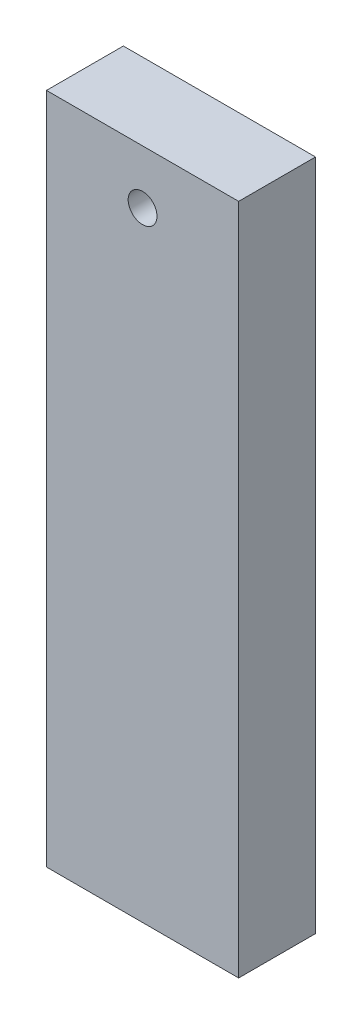
ISO-10303-21;
HEADER;
FILE_DESCRIPTION(('STEP AP214'),'2;1');
FILE_NAME('part.step','',(''),(''),'','','');
FILE_SCHEMA(('AUTOMOTIVE_DESIGN { 1 0 10303 214 1 1 1 1 }'));
ENDSEC;
DATA;
#1=APPLICATION_CONTEXT('core data for automotive mechanical design processes');
#2=APPLICATION_PROTOCOL_DEFINITION('international standard','automotive_design',2000,#1);
#3=PRODUCT_CONTEXT('',#1,'mechanical');
#4=PRODUCT('Part','Part','',(#3));
#5=PRODUCT_RELATED_PRODUCT_CATEGORY('part','',(#4));
#6=PRODUCT_DEFINITION_FORMATION('','',#4);
#7=PRODUCT_DEFINITION_CONTEXT('part definition',#1,'design');
#8=PRODUCT_DEFINITION('design','',#6,#7);
#9=PRODUCT_DEFINITION_SHAPE('','',#8);
#10=(LENGTH_UNIT() NAMED_UNIT(*) SI_UNIT(.MILLI.,.METRE.));
#11=(NAMED_UNIT(*) PLANE_ANGLE_UNIT() SI_UNIT($,.RADIAN.));
#12=(NAMED_UNIT(*) SI_UNIT($,.STERADIAN.) SOLID_ANGLE_UNIT());
#13=UNCERTAINTY_MEASURE_WITH_UNIT(LENGTH_MEASURE(1.E-05),#10,'distance_accuracy_value','');
#14=(GEOMETRIC_REPRESENTATION_CONTEXT(3) GLOBAL_UNCERTAINTY_ASSIGNED_CONTEXT((#13)) GLOBAL_UNIT_ASSIGNED_CONTEXT((#10,
#11,#12)) REPRESENTATION_CONTEXT('',''));
#15=CARTESIAN_POINT('',(0.,0.,0.));
#16=DIRECTION('',(0.,0.,1.));
#17=DIRECTION('',(1.,0.,0.));
#18=AXIS2_PLACEMENT_3D('',#15,#16,#17);
#19=CARTESIAN_POINT('',(-25.4,177.8,-10.16));
#20=DIRECTION('',(1.,0.,0.));
#21=DIRECTION('',(0.,0.,-1.));
#22=AXIS2_PLACEMENT_3D('',#19,#20,#21);
#23=PLANE('',#22);
#24=DIRECTION('',(0.,0.,1.));
#25=VECTOR('',#24,1.);
#26=CARTESIAN_POINT('',(-25.4,0.,-10.16));
#27=LINE('',#26,#25);
#28=CARTESIAN_POINT('',(-25.4,0.,-10.16));
#29=VERTEX_POINT('',#28);
#30=CARTESIAN_POINT('',(-25.4,0.,10.16));
#31=VERTEX_POINT('',#30);
#32=EDGE_CURVE('E113',#29,#31,#27,.T.);
#33=ORIENTED_EDGE('',*,*,#32,.T.);
#34=DIRECTION('',(0.,-1.,0.));
#35=VECTOR('',#34,1.);
#36=CARTESIAN_POINT('',(-25.4,177.8,10.16));
#37=LINE('',#36,#35);
#38=CARTESIAN_POINT('',(-25.4,177.8,10.16));
#39=VERTEX_POINT('',#38);
#40=EDGE_CURVE('E11',#39,#31,#37,.T.);
#41=ORIENTED_EDGE('',*,*,#40,.F.);
#42=DIRECTION('',(0.,0.,1.));
#43=VECTOR('',#42,1.);
#44=CARTESIAN_POINT('',(-25.4,177.8,-10.16));
#45=LINE('',#44,#43);
#46=CARTESIAN_POINT('',(-25.4,177.8,-10.16));
#47=VERTEX_POINT('',#46);
#48=EDGE_CURVE('E95',#47,#39,#45,.T.);
#49=ORIENTED_EDGE('',*,*,#48,.F.);
#50=DIRECTION('',(0.,-1.,0.));
#51=VECTOR('',#50,1.);
#52=CARTESIAN_POINT('',(-25.4,177.8,-10.16));
#53=LINE('',#52,#51);
#54=EDGE_CURVE('E62',#47,#29,#53,.T.);
#55=ORIENTED_EDGE('',*,*,#54,.T.);
#56=EDGE_LOOP('',(#33,#41,#49,#55));
#57=FACE_BOUND('',#56,.T.);
#58=ADVANCED_FACE('F45',(#57),#23,.F.);
#59=CARTESIAN_POINT('',(-25.4,177.8,10.16));
#60=DIRECTION('',(0.,0.,-1.));
#61=DIRECTION('',(-1.,0.,0.));
#62=AXIS2_PLACEMENT_3D('',#59,#60,#61);
#63=PLANE('',#62);
#64=CARTESIAN_POINT('',(0.,163.576,10.16));
#65=DIRECTION('',(0.,0.,-1.));
#66=DIRECTION('',(-1.,0.,0.));
#67=AXIS2_PLACEMENT_3D('',#64,#65,#66);
#68=CIRCLE('',#67,3.81);
#69=CARTESIAN_POINT('',(-3.81,163.576,10.16));
#70=VERTEX_POINT('',#69);
#71=EDGE_CURVE('E116',#70,#70,#68,.T.);
#72=ORIENTED_EDGE('',*,*,#71,.T.);
#73=EDGE_LOOP('',(#72));
#74=FACE_BOUND('',#73,.T.);
#75=DIRECTION('',(1.,0.,0.));
#76=VECTOR('',#75,1.);
#77=CARTESIAN_POINT('',(-25.4,0.,10.16));
#78=LINE('',#77,#76);
#79=CARTESIAN_POINT('',(25.4,0.,10.16));
#80=VERTEX_POINT('',#79);
#81=EDGE_CURVE('E101',#31,#80,#78,.T.);
#82=ORIENTED_EDGE('',*,*,#81,.T.);
#83=DIRECTION('',(0.,-1.,0.));
#84=VECTOR('',#83,1.);
#85=CARTESIAN_POINT('',(25.4,177.8,10.16));
#86=LINE('',#85,#84);
#87=CARTESIAN_POINT('',(25.4,177.8,10.16));
#88=VERTEX_POINT('',#87);
#89=EDGE_CURVE('E54',#88,#80,#86,.T.);
#90=ORIENTED_EDGE('',*,*,#89,.F.);
#91=DIRECTION('',(1.,0.,0.));
#92=VECTOR('',#91,1.);
#93=CARTESIAN_POINT('',(-25.4,177.8,10.16));
#94=LINE('',#93,#92);
#95=EDGE_CURVE('E87',#39,#88,#94,.T.);
#96=ORIENTED_EDGE('',*,*,#95,.F.);
#97=ORIENTED_EDGE('',*,*,#40,.T.);
#98=EDGE_LOOP('',(#82,#90,#96,#97));
#99=FACE_BOUND('',#98,.T.);
#100=ADVANCED_FACE('F100',(#74,#99),#63,.F.);
#101=CARTESIAN_POINT('',(25.4,177.8,-10.16));
#102=DIRECTION('',(1.,0.,0.));
#103=DIRECTION('',(0.,0.,-1.));
#104=AXIS2_PLACEMENT_3D('',#101,#102,#103);
#105=PLANE('',#104);
#106=DIRECTION('',(0.,0.,1.));
#107=VECTOR('',#106,1.);
#108=CARTESIAN_POINT('',(25.4,0.,-10.16));
#109=LINE('',#108,#107);
#110=CARTESIAN_POINT('',(25.4,0.,-10.16));
#111=VERTEX_POINT('',#110);
#112=EDGE_CURVE('E119',#111,#80,#109,.T.);
#113=ORIENTED_EDGE('',*,*,#112,.F.);
#114=DIRECTION('',(0.,-1.,0.));
#115=VECTOR('',#114,1.);
#116=CARTESIAN_POINT('',(25.4,177.8,-10.16));
#117=LINE('',#116,#115);
#118=CARTESIAN_POINT('',(25.4,177.8,-10.16));
#119=VERTEX_POINT('',#118);
#120=EDGE_CURVE('E76',#119,#111,#117,.T.);
#121=ORIENTED_EDGE('',*,*,#120,.F.);
#122=DIRECTION('',(0.,0.,1.));
#123=VECTOR('',#122,1.);
#124=CARTESIAN_POINT('',(25.4,177.8,-10.16));
#125=LINE('',#124,#123);
#126=EDGE_CURVE('E94',#119,#88,#125,.T.);
#127=ORIENTED_EDGE('',*,*,#126,.T.);
#128=ORIENTED_EDGE('',*,*,#89,.T.);
#129=EDGE_LOOP('',(#113,#121,#127,#128));
#130=FACE_BOUND('',#129,.T.);
#131=ADVANCED_FACE('F105',(#130),#105,.T.);
#132=CARTESIAN_POINT('',(-25.4,177.8,-10.16));
#133=DIRECTION('',(0.,0.,-1.));
#134=DIRECTION('',(-1.,0.,0.));
#135=AXIS2_PLACEMENT_3D('',#132,#133,#134);
#136=PLANE('',#135);
#137=CARTESIAN_POINT('',(0.,163.576,-10.16));
#138=DIRECTION('',(0.,0.,-1.));
#139=DIRECTION('',(-1.,0.,0.));
#140=AXIS2_PLACEMENT_3D('',#137,#138,#139);
#141=CIRCLE('',#140,3.81);
#142=CARTESIAN_POINT('',(-3.81,163.576,-10.16));
#143=VERTEX_POINT('',#142);
#144=EDGE_CURVE('E132',#143,#143,#141,.T.);
#145=ORIENTED_EDGE('',*,*,#144,.F.);
#146=EDGE_LOOP('',(#145));
#147=FACE_BOUND('',#146,.T.);
#148=DIRECTION('',(1.,0.,0.));
#149=VECTOR('',#148,1.);
#150=CARTESIAN_POINT('',(-25.4,0.,-10.16));
#151=LINE('',#150,#149);
#152=EDGE_CURVE('E122',#29,#111,#151,.T.);
#153=ORIENTED_EDGE('',*,*,#152,.F.);
#154=ORIENTED_EDGE('',*,*,#54,.F.);
#155=DIRECTION('',(1.,0.,0.));
#156=VECTOR('',#155,1.);
#157=CARTESIAN_POINT('',(-25.4,177.8,-10.16));
#158=LINE('',#157,#156);
#159=EDGE_CURVE('E107',#47,#119,#158,.T.);
#160=ORIENTED_EDGE('',*,*,#159,.T.);
#161=ORIENTED_EDGE('',*,*,#120,.T.);
#162=EDGE_LOOP('',(#153,#154,#160,#161));
#163=FACE_BOUND('',#162,.T.);
#164=ADVANCED_FACE('F148',(#147,#163),#136,.T.);
#165=CARTESIAN_POINT('',(0.,177.8,0.));
#166=DIRECTION('',(0.,1.,0.));
#167=DIRECTION('',(0.,0.,1.));
#168=AXIS2_PLACEMENT_3D('',#165,#166,#167);
#169=PLANE('',#168);
#170=ORIENTED_EDGE('',*,*,#48,.T.);
#171=ORIENTED_EDGE('',*,*,#95,.T.);
#172=ORIENTED_EDGE('',*,*,#126,.F.);
#173=ORIENTED_EDGE('',*,*,#159,.F.);
#174=EDGE_LOOP('',(#170,#171,#172,#173));
#175=FACE_BOUND('',#174,.T.);
#176=ADVANCED_FACE('F91',(#175),#169,.T.);
#177=CARTESIAN_POINT('',(0.,0.,0.));
#178=DIRECTION('',(0.,1.,0.));
#179=DIRECTION('',(0.,0.,1.));
#180=AXIS2_PLACEMENT_3D('',#177,#178,#179);
#181=PLANE('',#180);
#182=ORIENTED_EDGE('',*,*,#32,.F.);
#183=ORIENTED_EDGE('',*,*,#152,.T.);
#184=ORIENTED_EDGE('',*,*,#112,.T.);
#185=ORIENTED_EDGE('',*,*,#81,.F.);
#186=EDGE_LOOP('',(#182,#183,#184,#185));
#187=FACE_BOUND('',#186,.T.);
#188=ADVANCED_FACE('F144',(#187),#181,.F.);
#189=CARTESIAN_POINT('',(0.,163.576,10.16));
#190=DIRECTION('',(0.,0.,-1.));
#191=DIRECTION('',(-1.,0.,0.));
#192=AXIS2_PLACEMENT_3D('',#189,#190,#191);
#193=CYLINDRICAL_SURFACE('',#192,3.81);
#194=ORIENTED_EDGE('',*,*,#71,.F.);
#195=EDGE_LOOP('',(#194));
#196=FACE_BOUND('',#195,.T.);
#197=ORIENTED_EDGE('',*,*,#144,.T.);
#198=EDGE_LOOP('',(#197));
#199=FACE_BOUND('',#198,.T.);
#200=ADVANCED_FACE('F141',(#196,#199),#193,.F.);
#201=CLOSED_SHELL('',(#58,#100,#131,#164,#176,#188,#200));
#202=MANIFOLD_SOLID_BREP('B2',#201);
#203=ADVANCED_BREP_SHAPE_REPRESENTATION('',(#18,#202),#14);
#204=SHAPE_DEFINITION_REPRESENTATION(#9,#203);
ENDSEC;
END-ISO-10303-21;
